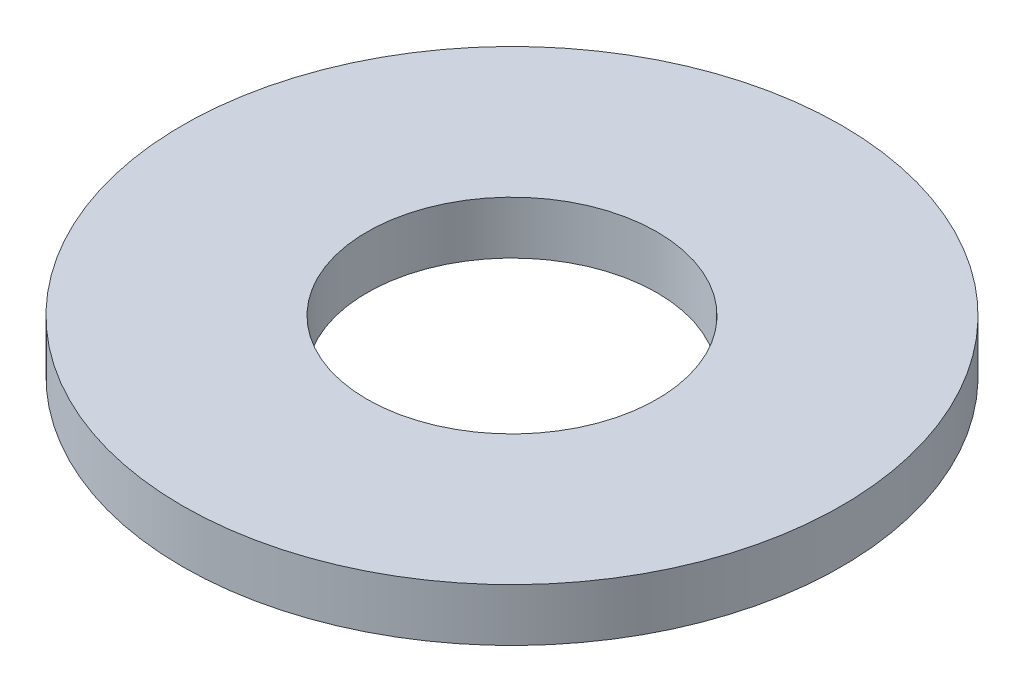
ISO-10303-21;
HEADER;
FILE_DESCRIPTION(('STEP AP214'),'2;1');
FILE_NAME('part.step','',(''),(''),'','','');
FILE_SCHEMA(('AUTOMOTIVE_DESIGN { 1 0 10303 214 1 1 1 1 }'));
ENDSEC;
DATA;
#1=APPLICATION_CONTEXT('core data for automotive mechanical design processes');
#2=APPLICATION_PROTOCOL_DEFINITION('international standard','automotive_design',2000,#1);
#3=PRODUCT_CONTEXT('',#1,'mechanical');
#4=PRODUCT('Part','Part','',(#3));
#5=PRODUCT_RELATED_PRODUCT_CATEGORY('part','',(#4));
#6=PRODUCT_DEFINITION_FORMATION('','',#4);
#7=PRODUCT_DEFINITION_CONTEXT('part definition',#1,'design');
#8=PRODUCT_DEFINITION('design','',#6,#7);
#9=PRODUCT_DEFINITION_SHAPE('','',#8);
#10=(LENGTH_UNIT() NAMED_UNIT(*) SI_UNIT(.MILLI.,.METRE.));
#11=(NAMED_UNIT(*) PLANE_ANGLE_UNIT() SI_UNIT($,.RADIAN.));
#12=(NAMED_UNIT(*) SI_UNIT($,.STERADIAN.) SOLID_ANGLE_UNIT());
#13=UNCERTAINTY_MEASURE_WITH_UNIT(LENGTH_MEASURE(1.E-05),#10,'distance_accuracy_value','');
#14=(GEOMETRIC_REPRESENTATION_CONTEXT(3) GLOBAL_UNCERTAINTY_ASSIGNED_CONTEXT((#13)) GLOBAL_UNIT_ASSIGNED_CONTEXT((#10,
#11,#12)) REPRESENTATION_CONTEXT('',''));
#15=CARTESIAN_POINT('',(0.,0.,0.));
#16=DIRECTION('',(0.,0.,1.));
#17=DIRECTION('',(1.,0.,0.));
#18=AXIS2_PLACEMENT_3D('',#15,#16,#17);
#19=CARTESIAN_POINT('',(0.,0.4,0.));
#20=DIRECTION('',(0.,-1.,0.));
#21=DIRECTION('',(0.,0.,-1.));
#22=AXIS2_PLACEMENT_3D('',#19,#20,#21);
#23=CYLINDRICAL_SURFACE('',#22,2.5);
#24=CARTESIAN_POINT('',(0.,0.4,0.));
#25=DIRECTION('',(0.,1.,0.));
#26=DIRECTION('',(0.,0.,1.));
#27=AXIS2_PLACEMENT_3D('',#24,#25,#26);
#28=CIRCLE('',#27,2.5);
#29=CARTESIAN_POINT('',(0.,0.4,2.5));
#30=VERTEX_POINT('',#29);
#31=EDGE_CURVE('E10',#30,#30,#28,.T.);
#32=ORIENTED_EDGE('',*,*,#31,.F.);
#33=EDGE_LOOP('',(#32));
#34=FACE_BOUND('',#33,.T.);
#35=CARTESIAN_POINT('',(0.,0.,0.));
#36=DIRECTION('',(0.,1.,0.));
#37=DIRECTION('',(0.,0.,1.));
#38=AXIS2_PLACEMENT_3D('',#35,#36,#37);
#39=CIRCLE('',#38,2.5);
#40=CARTESIAN_POINT('',(0.,0.,2.5));
#41=VERTEX_POINT('',#40);
#42=EDGE_CURVE('E35',#41,#41,#39,.T.);
#43=ORIENTED_EDGE('',*,*,#42,.T.);
#44=EDGE_LOOP('',(#43));
#45=FACE_BOUND('',#44,.T.);
#46=ADVANCED_FACE('F32',(#34,#45),#23,.T.);
#47=CARTESIAN_POINT('',(0.,0.4,0.));
#48=DIRECTION('',(0.,1.,0.));
#49=DIRECTION('',(0.,0.,1.));
#50=AXIS2_PLACEMENT_3D('',#47,#48,#49);
#51=PLANE('',#50);
#52=CARTESIAN_POINT('',(0.,0.4,0.));
#53=DIRECTION('',(0.,1.,0.));
#54=DIRECTION('',(0.,0.,1.));
#55=AXIS2_PLACEMENT_3D('',#52,#53,#54);
#56=CIRCLE('',#55,1.1);
#57=CARTESIAN_POINT('',(0.,0.4,1.1));
#58=VERTEX_POINT('',#57);
#59=EDGE_CURVE('E44',#58,#58,#56,.T.);
#60=ORIENTED_EDGE('',*,*,#59,.F.);
#61=EDGE_LOOP('',(#60));
#62=FACE_BOUND('',#61,.T.);
#63=ORIENTED_EDGE('',*,*,#31,.T.);
#64=EDGE_LOOP('',(#63));
#65=FACE_BOUND('',#64,.T.);
#66=ADVANCED_FACE('F59',(#62,#65),#51,.T.);
#67=CARTESIAN_POINT('',(0.,0.,0.));
#68=DIRECTION('',(0.,1.,0.));
#69=DIRECTION('',(0.,0.,1.));
#70=AXIS2_PLACEMENT_3D('',#67,#68,#69);
#71=PLANE('',#70);
#72=CARTESIAN_POINT('',(0.,0.,0.));
#73=DIRECTION('',(0.,1.,0.));
#74=DIRECTION('',(0.,0.,1.));
#75=AXIS2_PLACEMENT_3D('',#72,#73,#74);
#76=CIRCLE('',#75,1.1);
#77=CARTESIAN_POINT('',(0.,0.,1.1));
#78=VERTEX_POINT('',#77);
#79=EDGE_CURVE('E42',#78,#78,#76,.T.);
#80=ORIENTED_EDGE('',*,*,#79,.T.);
#81=EDGE_LOOP('',(#80));
#82=FACE_BOUND('',#81,.T.);
#83=ORIENTED_EDGE('',*,*,#42,.F.);
#84=EDGE_LOOP('',(#83));
#85=FACE_BOUND('',#84,.T.);
#86=ADVANCED_FACE('F50',(#82,#85),#71,.F.);
#87=CARTESIAN_POINT('',(0.,0.,0.));
#88=DIRECTION('',(0.,1.,0.));
#89=DIRECTION('',(0.,0.,1.));
#90=AXIS2_PLACEMENT_3D('',#87,#88,#89);
#91=CYLINDRICAL_SURFACE('',#90,1.1);
#92=ORIENTED_EDGE('',*,*,#79,.F.);
#93=EDGE_LOOP('',(#92));
#94=FACE_BOUND('',#93,.T.);
#95=ORIENTED_EDGE('',*,*,#59,.T.);
#96=EDGE_LOOP('',(#95));
#97=FACE_BOUND('',#96,.T.);
#98=ADVANCED_FACE('F53',(#94,#97),#91,.F.);
#99=CLOSED_SHELL('',(#46,#66,#86,#98));
#100=MANIFOLD_SOLID_BREP('B2',#99);
#101=ADVANCED_BREP_SHAPE_REPRESENTATION('',(#18,#100),#14);
#102=SHAPE_DEFINITION_REPRESENTATION(#9,#101);
ENDSEC;
END-ISO-10303-21;
